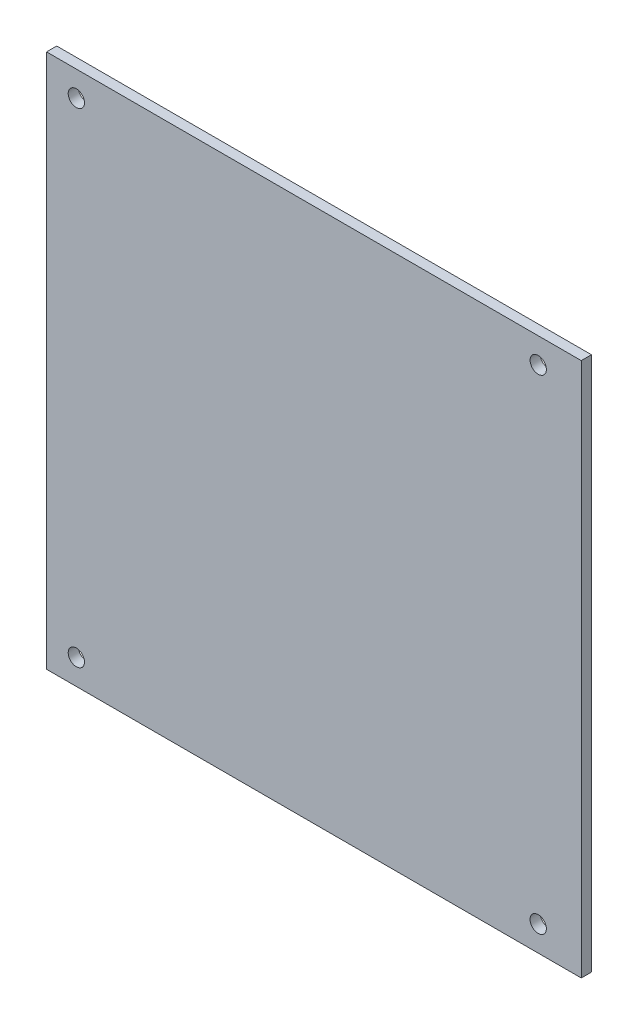
ISO-10303-21;
HEADER;
FILE_DESCRIPTION(('STEP AP214'),'2;1');
FILE_NAME('part.step','',(''),(''),'','','');
FILE_SCHEMA(('AUTOMOTIVE_DESIGN { 1 0 10303 214 1 1 1 1 }'));
ENDSEC;
DATA;
#1=APPLICATION_CONTEXT('core data for automotive mechanical design processes');
#2=APPLICATION_PROTOCOL_DEFINITION('international standard','automotive_design',2000,#1);
#3=PRODUCT_CONTEXT('',#1,'mechanical');
#4=PRODUCT('Part','Part','',(#3));
#5=PRODUCT_RELATED_PRODUCT_CATEGORY('part','',(#4));
#6=PRODUCT_DEFINITION_FORMATION('','',#4);
#7=PRODUCT_DEFINITION_CONTEXT('part definition',#1,'design');
#8=PRODUCT_DEFINITION('design','',#6,#7);
#9=PRODUCT_DEFINITION_SHAPE('','',#8);
#10=(LENGTH_UNIT() NAMED_UNIT(*) SI_UNIT(.MILLI.,.METRE.));
#11=(NAMED_UNIT(*) PLANE_ANGLE_UNIT() SI_UNIT($,.RADIAN.));
#12=(NAMED_UNIT(*) SI_UNIT($,.STERADIAN.) SOLID_ANGLE_UNIT());
#13=UNCERTAINTY_MEASURE_WITH_UNIT(LENGTH_MEASURE(1.E-05),#10,'distance_accuracy_value','');
#14=(GEOMETRIC_REPRESENTATION_CONTEXT(3) GLOBAL_UNCERTAINTY_ASSIGNED_CONTEXT((#13)) GLOBAL_UNIT_ASSIGNED_CONTEXT((#10,
#11,#12)) REPRESENTATION_CONTEXT('',''));
#15=CARTESIAN_POINT('',(0.,0.,0.));
#16=DIRECTION('',(0.,0.,1.));
#17=DIRECTION('',(1.,0.,0.));
#18=AXIS2_PLACEMENT_3D('',#15,#16,#17);
#19=CARTESIAN_POINT('',(0.,0.,2.));
#20=DIRECTION('',(0.,0.,-1.));
#21=DIRECTION('',(-1.,0.,0.));
#22=AXIS2_PLACEMENT_3D('',#19,#20,#21);
#23=PLANE('',#22);
#24=DIRECTION('',(-1.,0.,0.));
#25=VECTOR('',#24,1.);
#26=CARTESIAN_POINT('',(-52.5,52.5,2.));
#27=LINE('',#26,#25);
#28=CARTESIAN_POINT('',(52.5,52.5,2.));
#29=VERTEX_POINT('',#28);
#30=CARTESIAN_POINT('',(-52.5,52.5,2.));
#31=VERTEX_POINT('',#30);
#32=EDGE_CURVE('E57',#29,#31,#27,.T.);
#33=ORIENTED_EDGE('',*,*,#32,.T.);
#34=DIRECTION('',(0.,-1.,0.));
#35=VECTOR('',#34,1.);
#36=CARTESIAN_POINT('',(-52.5,-52.5,2.));
#37=LINE('',#36,#35);
#38=CARTESIAN_POINT('',(-52.5,-52.5,2.));
#39=VERTEX_POINT('',#38);
#40=EDGE_CURVE('E88',#31,#39,#37,.T.);
#41=ORIENTED_EDGE('',*,*,#40,.T.);
#42=DIRECTION('',(1.,0.,0.));
#43=VECTOR('',#42,1.);
#44=CARTESIAN_POINT('',(52.5,-52.5,2.));
#45=LINE('',#44,#43);
#46=CARTESIAN_POINT('',(52.5,-52.5,2.));
#47=VERTEX_POINT('',#46);
#48=EDGE_CURVE('E92',#39,#47,#45,.T.);
#49=ORIENTED_EDGE('',*,*,#48,.T.);
#50=DIRECTION('',(0.,1.,0.));
#51=VECTOR('',#50,1.);
#52=CARTESIAN_POINT('',(52.5,52.5,2.));
#53=LINE('',#52,#51);
#54=EDGE_CURVE('E102',#47,#29,#53,.T.);
#55=ORIENTED_EDGE('',*,*,#54,.T.);
#56=EDGE_LOOP('',(#33,#41,#49,#55));
#57=FACE_BOUND('',#56,.T.);
#58=CARTESIAN_POINT('',(-46.65,47.55,2.));
#59=DIRECTION('',(0.,0.,1.));
#60=DIRECTION('',(1.,0.,0.));
#61=AXIS2_PLACEMENT_3D('',#58,#59,#60);
#62=CIRCLE('',#61,1.6);
#63=CARTESIAN_POINT('',(-45.05,47.55,2.));
#64=VERTEX_POINT('',#63);
#65=EDGE_CURVE('E111',#64,#64,#62,.T.);
#66=ORIENTED_EDGE('',*,*,#65,.F.);
#67=EDGE_LOOP('',(#66));
#68=FACE_BOUND('',#67,.T.);
#69=CARTESIAN_POINT('',(44.05,47.55,2.));
#70=DIRECTION('',(0.,0.,1.));
#71=DIRECTION('',(1.,0.,0.));
#72=AXIS2_PLACEMENT_3D('',#69,#70,#71);
#73=CIRCLE('',#72,1.6);
#74=CARTESIAN_POINT('',(45.65,47.55,2.));
#75=VERTEX_POINT('',#74);
#76=EDGE_CURVE('E181',#75,#75,#73,.T.);
#77=ORIENTED_EDGE('',*,*,#76,.F.);
#78=EDGE_LOOP('',(#77));
#79=FACE_BOUND('',#78,.T.);
#80=CARTESIAN_POINT('',(-46.65,-47.55,2.));
#81=DIRECTION('',(0.,0.,1.));
#82=DIRECTION('',(1.,0.,0.));
#83=AXIS2_PLACEMENT_3D('',#80,#81,#82);
#84=CIRCLE('',#83,1.6);
#85=CARTESIAN_POINT('',(-45.05,-47.55,2.));
#86=VERTEX_POINT('',#85);
#87=EDGE_CURVE('E173',#86,#86,#84,.T.);
#88=ORIENTED_EDGE('',*,*,#87,.F.);
#89=EDGE_LOOP('',(#88));
#90=FACE_BOUND('',#89,.T.);
#91=CARTESIAN_POINT('',(44.05,-47.55,2.));
#92=DIRECTION('',(0.,0.,1.));
#93=DIRECTION('',(1.,0.,0.));
#94=AXIS2_PLACEMENT_3D('',#91,#92,#93);
#95=CIRCLE('',#94,1.6);
#96=CARTESIAN_POINT('',(45.65,-47.55,2.));
#97=VERTEX_POINT('',#96);
#98=EDGE_CURVE('E162',#97,#97,#95,.T.);
#99=ORIENTED_EDGE('',*,*,#98,.F.);
#100=EDGE_LOOP('',(#99));
#101=FACE_BOUND('',#100,.T.);
#102=ADVANCED_FACE('F39',(#57,#68,#79,#90,#101),#23,.F.);
#103=CARTESIAN_POINT('',(0.,0.,0.));
#104=DIRECTION('',(0.,0.,-1.));
#105=DIRECTION('',(-1.,0.,0.));
#106=AXIS2_PLACEMENT_3D('',#103,#104,#105);
#107=PLANE('',#106);
#108=CARTESIAN_POINT('',(-46.65,-47.55,0.));
#109=DIRECTION('',(0.,0.,1.));
#110=DIRECTION('',(1.,0.,0.));
#111=AXIS2_PLACEMENT_3D('',#108,#109,#110);
#112=CIRCLE('',#111,1.6);
#113=CARTESIAN_POINT('',(-45.05,-47.55,0.));
#114=VERTEX_POINT('',#113);
#115=EDGE_CURVE('E170',#114,#114,#112,.T.);
#116=ORIENTED_EDGE('',*,*,#115,.T.);
#117=EDGE_LOOP('',(#116));
#118=FACE_BOUND('',#117,.T.);
#119=CARTESIAN_POINT('',(-46.65,47.55,0.));
#120=DIRECTION('',(0.,0.,1.));
#121=DIRECTION('',(1.,0.,0.));
#122=AXIS2_PLACEMENT_3D('',#119,#120,#121);
#123=CIRCLE('',#122,1.6);
#124=CARTESIAN_POINT('',(-45.05,47.55,0.));
#125=VERTEX_POINT('',#124);
#126=EDGE_CURVE('E185',#125,#125,#123,.T.);
#127=ORIENTED_EDGE('',*,*,#126,.T.);
#128=EDGE_LOOP('',(#127));
#129=FACE_BOUND('',#128,.T.);
#130=DIRECTION('',(0.,-1.,0.));
#131=VECTOR('',#130,1.);
#132=CARTESIAN_POINT('',(-52.5,-52.5,0.));
#133=LINE('',#132,#131);
#134=CARTESIAN_POINT('',(-52.5,52.5,0.));
#135=VERTEX_POINT('',#134);
#136=CARTESIAN_POINT('',(-52.5,-52.5,0.));
#137=VERTEX_POINT('',#136);
#138=EDGE_CURVE('E96',#135,#137,#133,.T.);
#139=ORIENTED_EDGE('',*,*,#138,.F.);
#140=DIRECTION('',(-1.,0.,0.));
#141=VECTOR('',#140,1.);
#142=CARTESIAN_POINT('',(0.,52.5,0.));
#143=LINE('',#142,#141);
#144=CARTESIAN_POINT('',(52.5,52.5,0.));
#145=VERTEX_POINT('',#144);
#146=EDGE_CURVE('E116',#145,#135,#143,.T.);
#147=ORIENTED_EDGE('',*,*,#146,.F.);
#148=DIRECTION('',(0.,1.,0.));
#149=VECTOR('',#148,1.);
#150=CARTESIAN_POINT('',(52.5,52.5,0.));
#151=LINE('',#150,#149);
#152=CARTESIAN_POINT('',(52.5,-52.5,0.));
#153=VERTEX_POINT('',#152);
#154=EDGE_CURVE('E82',#153,#145,#151,.T.);
#155=ORIENTED_EDGE('',*,*,#154,.F.);
#156=DIRECTION('',(1.,0.,0.));
#157=VECTOR('',#156,1.);
#158=CARTESIAN_POINT('',(52.5,-52.5,0.));
#159=LINE('',#158,#157);
#160=EDGE_CURVE('E75',#137,#153,#159,.T.);
#161=ORIENTED_EDGE('',*,*,#160,.F.);
#162=EDGE_LOOP('',(#139,#147,#155,#161));
#163=FACE_BOUND('',#162,.T.);
#164=CARTESIAN_POINT('',(44.05,47.55,0.));
#165=DIRECTION('',(0.,0.,1.));
#166=DIRECTION('',(1.,0.,0.));
#167=AXIS2_PLACEMENT_3D('',#164,#165,#166);
#168=CIRCLE('',#167,1.6);
#169=CARTESIAN_POINT('',(45.65,47.55,0.));
#170=VERTEX_POINT('',#169);
#171=EDGE_CURVE('E177',#170,#170,#168,.T.);
#172=ORIENTED_EDGE('',*,*,#171,.T.);
#173=EDGE_LOOP('',(#172));
#174=FACE_BOUND('',#173,.T.);
#175=CARTESIAN_POINT('',(44.05,-47.55,0.));
#176=DIRECTION('',(0.,0.,1.));
#177=DIRECTION('',(1.,0.,0.));
#178=AXIS2_PLACEMENT_3D('',#175,#176,#177);
#179=CIRCLE('',#178,1.6);
#180=CARTESIAN_POINT('',(45.65,-47.55,0.));
#181=VERTEX_POINT('',#180);
#182=EDGE_CURVE('E165',#181,#181,#179,.T.);
#183=ORIENTED_EDGE('',*,*,#182,.T.);
#184=EDGE_LOOP('',(#183));
#185=FACE_BOUND('',#184,.T.);
#186=ADVANCED_FACE('F125',(#118,#129,#163,#174,#185),#107,.T.);
#187=CARTESIAN_POINT('',(-52.5,-52.5,2.));
#188=DIRECTION('',(1.,0.,0.));
#189=DIRECTION('',(0.,0.,-1.));
#190=AXIS2_PLACEMENT_3D('',#187,#188,#189);
#191=PLANE('',#190);
#192=ORIENTED_EDGE('',*,*,#138,.T.);
#193=DIRECTION('',(0.,0.,-1.));
#194=VECTOR('',#193,1.);
#195=CARTESIAN_POINT('',(-52.5,-52.5,2.));
#196=LINE('',#195,#194);
#197=EDGE_CURVE('E49',#39,#137,#196,.T.);
#198=ORIENTED_EDGE('',*,*,#197,.F.);
#199=ORIENTED_EDGE('',*,*,#40,.F.);
#200=DIRECTION('',(0.,0.,-1.));
#201=VECTOR('',#200,1.);
#202=CARTESIAN_POINT('',(-52.5,52.5,2.));
#203=LINE('',#202,#201);
#204=EDGE_CURVE('E11',#31,#135,#203,.T.);
#205=ORIENTED_EDGE('',*,*,#204,.T.);
#206=EDGE_LOOP('',(#192,#198,#199,#205));
#207=FACE_BOUND('',#206,.T.);
#208=ADVANCED_FACE('F41',(#207),#191,.F.);
#209=CARTESIAN_POINT('',(52.5,-52.5,2.));
#210=DIRECTION('',(0.,1.,0.));
#211=DIRECTION('',(-1.,0.,0.));
#212=AXIS2_PLACEMENT_3D('',#209,#210,#211);
#213=PLANE('',#212);
#214=ORIENTED_EDGE('',*,*,#160,.T.);
#215=DIRECTION('',(0.,0.,-1.));
#216=VECTOR('',#215,1.);
#217=CARTESIAN_POINT('',(52.5,-52.5,2.));
#218=LINE('',#217,#216);
#219=EDGE_CURVE('E98',#47,#153,#218,.T.);
#220=ORIENTED_EDGE('',*,*,#219,.F.);
#221=ORIENTED_EDGE('',*,*,#48,.F.);
#222=ORIENTED_EDGE('',*,*,#197,.T.);
#223=EDGE_LOOP('',(#214,#220,#221,#222));
#224=FACE_BOUND('',#223,.T.);
#225=ADVANCED_FACE('F99',(#224),#213,.F.);
#226=CARTESIAN_POINT('',(52.5,52.5,2.));
#227=DIRECTION('',(-1.,0.,0.));
#228=DIRECTION('',(0.,-1.,0.));
#229=AXIS2_PLACEMENT_3D('',#226,#227,#228);
#230=PLANE('',#229);
#231=ORIENTED_EDGE('',*,*,#154,.T.);
#232=DIRECTION('',(0.,0.,-1.));
#233=VECTOR('',#232,1.);
#234=CARTESIAN_POINT('',(52.5,52.5,2.));
#235=LINE('',#234,#233);
#236=EDGE_CURVE('E105',#29,#145,#235,.T.);
#237=ORIENTED_EDGE('',*,*,#236,.F.);
#238=ORIENTED_EDGE('',*,*,#54,.F.);
#239=ORIENTED_EDGE('',*,*,#219,.T.);
#240=EDGE_LOOP('',(#231,#237,#238,#239));
#241=FACE_BOUND('',#240,.T.);
#242=ADVANCED_FACE('F122',(#241),#230,.F.);
#243=CARTESIAN_POINT('',(0.,52.5,2.));
#244=DIRECTION('',(0.,-1.,0.));
#245=DIRECTION('',(0.,0.,-1.));
#246=AXIS2_PLACEMENT_3D('',#243,#244,#245);
#247=PLANE('',#246);
#248=ORIENTED_EDGE('',*,*,#146,.T.);
#249=ORIENTED_EDGE('',*,*,#204,.F.);
#250=ORIENTED_EDGE('',*,*,#32,.F.);
#251=ORIENTED_EDGE('',*,*,#236,.T.);
#252=EDGE_LOOP('',(#248,#249,#250,#251));
#253=FACE_BOUND('',#252,.T.);
#254=ADVANCED_FACE('F127',(#253),#247,.F.);
#255=CARTESIAN_POINT('',(-46.65,47.55,2.));
#256=DIRECTION('',(0.,0.,-1.));
#257=DIRECTION('',(-1.,0.,0.));
#258=AXIS2_PLACEMENT_3D('',#255,#256,#257);
#259=CYLINDRICAL_SURFACE('',#258,1.6);
#260=ORIENTED_EDGE('',*,*,#65,.T.);
#261=EDGE_LOOP('',(#260));
#262=FACE_BOUND('',#261,.T.);
#263=ORIENTED_EDGE('',*,*,#126,.F.);
#264=EDGE_LOOP('',(#263));
#265=FACE_BOUND('',#264,.T.);
#266=ADVANCED_FACE('F129',(#262,#265),#259,.F.);
#267=CARTESIAN_POINT('',(44.05,47.55,2.));
#268=DIRECTION('',(0.,0.,-1.));
#269=DIRECTION('',(-1.,0.,0.));
#270=AXIS2_PLACEMENT_3D('',#267,#268,#269);
#271=CYLINDRICAL_SURFACE('',#270,1.6);
#272=ORIENTED_EDGE('',*,*,#76,.T.);
#273=EDGE_LOOP('',(#272));
#274=FACE_BOUND('',#273,.T.);
#275=ORIENTED_EDGE('',*,*,#171,.F.);
#276=EDGE_LOOP('',(#275));
#277=FACE_BOUND('',#276,.T.);
#278=ADVANCED_FACE('F135',(#274,#277),#271,.F.);
#279=CARTESIAN_POINT('',(-46.65,-47.55,2.));
#280=DIRECTION('',(0.,0.,-1.));
#281=DIRECTION('',(-1.,0.,0.));
#282=AXIS2_PLACEMENT_3D('',#279,#280,#281);
#283=CYLINDRICAL_SURFACE('',#282,1.6);
#284=ORIENTED_EDGE('',*,*,#87,.T.);
#285=EDGE_LOOP('',(#284));
#286=FACE_BOUND('',#285,.T.);
#287=ORIENTED_EDGE('',*,*,#115,.F.);
#288=EDGE_LOOP('',(#287));
#289=FACE_BOUND('',#288,.T.);
#290=ADVANCED_FACE('F149',(#286,#289),#283,.F.);
#291=CARTESIAN_POINT('',(44.05,-47.55,2.));
#292=DIRECTION('',(0.,0.,-1.));
#293=DIRECTION('',(-1.,0.,0.));
#294=AXIS2_PLACEMENT_3D('',#291,#292,#293);
#295=CYLINDRICAL_SURFACE('',#294,1.6);
#296=ORIENTED_EDGE('',*,*,#98,.T.);
#297=EDGE_LOOP('',(#296));
#298=FACE_BOUND('',#297,.T.);
#299=ORIENTED_EDGE('',*,*,#182,.F.);
#300=EDGE_LOOP('',(#299));
#301=FACE_BOUND('',#300,.T.);
#302=ADVANCED_FACE('F153',(#298,#301),#295,.F.);
#303=CLOSED_SHELL('',(#102,#186,#208,#225,#242,#254,#266,#278,#290,#302));
#304=MANIFOLD_SOLID_BREP('B2',#303);
#305=ADVANCED_BREP_SHAPE_REPRESENTATION('',(#18,#304),#14);
#306=SHAPE_DEFINITION_REPRESENTATION(#9,#305);
ENDSEC;
END-ISO-10303-21;
